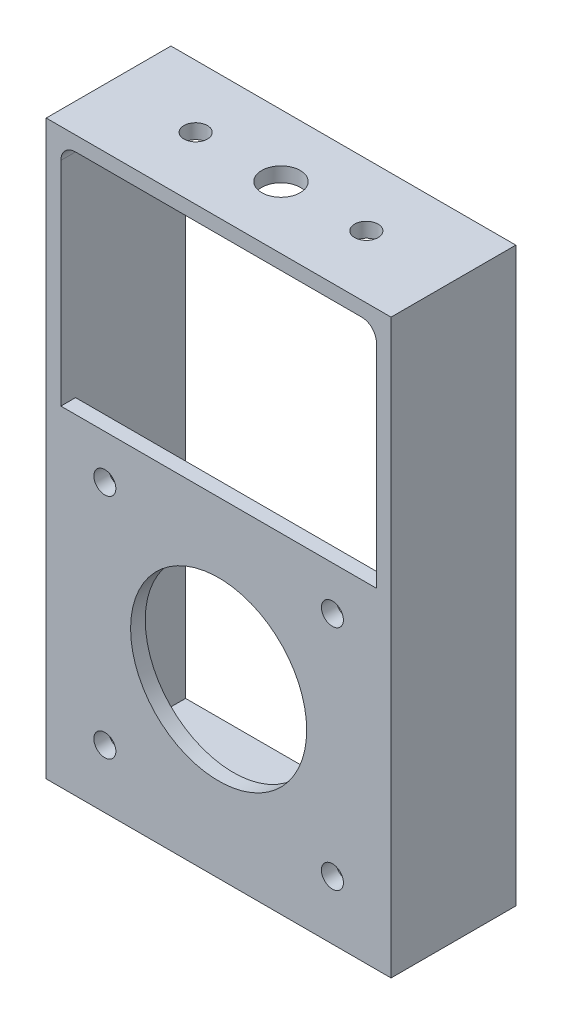
ISO-10303-21;
HEADER;
FILE_DESCRIPTION(('STEP AP214'),'2;1');
FILE_NAME('part.step','',(''),(''),'','','');
FILE_SCHEMA(('AUTOMOTIVE_DESIGN { 1 0 10303 214 1 1 1 1 }'));
ENDSEC;
DATA;
#1=APPLICATION_CONTEXT('core data for automotive mechanical design processes');
#2=APPLICATION_PROTOCOL_DEFINITION('international standard','automotive_design',2000,#1);
#3=PRODUCT_CONTEXT('',#1,'mechanical');
#4=PRODUCT('Part','Part','',(#3));
#5=PRODUCT_RELATED_PRODUCT_CATEGORY('part','',(#4));
#6=PRODUCT_DEFINITION_FORMATION('','',#4);
#7=PRODUCT_DEFINITION_CONTEXT('part definition',#1,'design');
#8=PRODUCT_DEFINITION('design','',#6,#7);
#9=PRODUCT_DEFINITION_SHAPE('','',#8);
#10=(LENGTH_UNIT() NAMED_UNIT(*) SI_UNIT(.MILLI.,.METRE.));
#11=(NAMED_UNIT(*) PLANE_ANGLE_UNIT() SI_UNIT($,.RADIAN.));
#12=(NAMED_UNIT(*) SI_UNIT($,.STERADIAN.) SOLID_ANGLE_UNIT());
#13=UNCERTAINTY_MEASURE_WITH_UNIT(LENGTH_MEASURE(1.E-05),#10,'distance_accuracy_value','');
#14=(GEOMETRIC_REPRESENTATION_CONTEXT(3) GLOBAL_UNCERTAINTY_ASSIGNED_CONTEXT((#13)) GLOBAL_UNIT_ASSIGNED_CONTEXT((#10,
#11,#12)) REPRESENTATION_CONTEXT('',''));
#15=CARTESIAN_POINT('',(0.,0.,0.));
#16=DIRECTION('',(0.,0.,1.));
#17=DIRECTION('',(1.,0.,0.));
#18=AXIS2_PLACEMENT_3D('',#15,#16,#17);
#19=CARTESIAN_POINT('',(0.,0.,15.));
#20=DIRECTION('',(0.,0.,1.));
#21=DIRECTION('',(1.,0.,0.));
#22=AXIS2_PLACEMENT_3D('',#19,#20,#21);
#23=PLANE('',#22);
#24=CARTESIAN_POINT('',(70.5833890467066,-3.39567391083385,15.));
#25=DIRECTION('',(0.,0.,-1.));
#26=DIRECTION('',(0.,1.,0.));
#27=AXIS2_PLACEMENT_3D('',#24,#25,#26);
#28=CIRCLE('',#27,1.5);
#29=CARTESIAN_POINT('',(70.5833890467066,-1.89567391083384,15.));
#30=VERTEX_POINT('',#29);
#31=EDGE_CURVE('E235',#30,#30,#28,.T.);
#32=ORIENTED_EDGE('',*,*,#31,.F.);
#33=EDGE_LOOP('',(#32));
#34=FACE_BOUND('',#33,.T.);
#35=CARTESIAN_POINT('',(70.5833890467065,-34.4093773336758,15.));
#36=DIRECTION('',(0.,0.,-1.));
#37=DIRECTION('',(1.,0.,0.));
#38=AXIS2_PLACEMENT_3D('',#35,#36,#37);
#39=CIRCLE('',#38,1.5);
#40=CARTESIAN_POINT('',(72.0833890467065,-34.4093773336758,15.));
#41=VERTEX_POINT('',#40);
#42=EDGE_CURVE('E338',#41,#41,#39,.T.);
#43=ORIENTED_EDGE('',*,*,#42,.F.);
#44=EDGE_LOOP('',(#43));
#45=FACE_BOUND('',#44,.T.);
#46=CARTESIAN_POINT('',(39.5696856238644,-34.4093773336756,15.));
#47=DIRECTION('',(0.,0.,-1.));
#48=DIRECTION('',(0.,-1.,0.));
#49=AXIS2_PLACEMENT_3D('',#46,#47,#48);
#50=CIRCLE('',#49,1.5);
#51=CARTESIAN_POINT('',(39.5696856238644,-35.9093773336756,15.));
#52=VERTEX_POINT('',#51);
#53=EDGE_CURVE('E251',#52,#52,#50,.T.);
#54=ORIENTED_EDGE('',*,*,#53,.F.);
#55=EDGE_LOOP('',(#54));
#56=FACE_BOUND('',#55,.T.);
#57=CARTESIAN_POINT('',(39.5696856238645,-3.39567391083379,15.));
#58=DIRECTION('',(0.,0.,-1.));
#59=DIRECTION('',(-1.,0.,0.));
#60=AXIS2_PLACEMENT_3D('',#57,#58,#59);
#61=CIRCLE('',#60,1.5);
#62=CARTESIAN_POINT('',(38.0696856238645,-3.39567391083379,15.));
#63=VERTEX_POINT('',#62);
#64=EDGE_CURVE('E230',#63,#63,#61,.T.);
#65=ORIENTED_EDGE('',*,*,#64,.F.);
#66=EDGE_LOOP('',(#65));
#67=FACE_BOUND('',#66,.T.);
#68=CARTESIAN_POINT('',(55.0765373352855,-18.9025256222548,15.));
#69=DIRECTION('',(0.,0.,-1.));
#70=DIRECTION('',(-1.,0.,0.));
#71=AXIS2_PLACEMENT_3D('',#68,#69,#70);
#72=CIRCLE('',#71,12.);
#73=CARTESIAN_POINT('',(43.0765373352855,-18.9025256222548,15.));
#74=VERTEX_POINT('',#73);
#75=EDGE_CURVE('E226',#74,#74,#72,.T.);
#76=ORIENTED_EDGE('',*,*,#75,.F.);
#77=EDGE_LOOP('',(#76));
#78=FACE_BOUND('',#77,.T.);
#79=DIRECTION('',(-1.,0.,0.));
#80=VECTOR('',#79,1.);
#81=CARTESIAN_POINT('',(76.5765373352855,2.59747437774523,15.));
#82=LINE('',#81,#80);
#83=CARTESIAN_POINT('',(76.5765373352855,2.59747437774523,15.));
#84=VERTEX_POINT('',#83);
#85=CARTESIAN_POINT('',(33.5765373352855,2.59747437774523,15.));
#86=VERTEX_POINT('',#85);
#87=EDGE_CURVE('E161',#84,#86,#82,.T.);
#88=ORIENTED_EDGE('',*,*,#87,.F.);
#89=DIRECTION('',(0.,1.,0.));
#90=VECTOR('',#89,1.);
#91=CARTESIAN_POINT('',(76.5765373352855,33.5974743777452,15.));
#92=LINE('',#91,#90);
#93=CARTESIAN_POINT('',(76.5765373352855,-40.4025256222548,15.));
#94=VERTEX_POINT('',#93);
#95=EDGE_CURVE('E173',#94,#84,#92,.T.);
#96=ORIENTED_EDGE('',*,*,#95,.F.);
#97=DIRECTION('',(1.,0.,0.));
#98=VECTOR('',#97,1.);
#99=CARTESIAN_POINT('',(33.5765373352855,-40.4025256222548,15.));
#100=LINE('',#99,#98);
#101=CARTESIAN_POINT('',(33.5765373352855,-40.4025256222548,15.));
#102=VERTEX_POINT('',#101);
#103=EDGE_CURVE('E169',#102,#94,#100,.T.);
#104=ORIENTED_EDGE('',*,*,#103,.F.);
#105=DIRECTION('',(0.,-1.,0.));
#106=VECTOR('',#105,1.);
#107=CARTESIAN_POINT('',(33.5765373352855,33.5974743777452,15.));
#108=LINE('',#107,#106);
#109=EDGE_CURVE('E151',#86,#102,#108,.T.);
#110=ORIENTED_EDGE('',*,*,#109,.F.);
#111=EDGE_LOOP('',(#88,#96,#104,#110));
#112=FACE_BOUND('',#111,.T.);
#113=ADVANCED_FACE('F57',(#34,#45,#56,#67,#78,#112),#23,.F.);
#114=CARTESIAN_POINT('',(0.,0.,0.));
#115=DIRECTION('',(0.,0.,1.));
#116=DIRECTION('',(1.,0.,0.));
#117=AXIS2_PLACEMENT_3D('',#114,#115,#116);
#118=PLANE('',#117);
#119=DIRECTION('',(0.,-1.,0.));
#120=VECTOR('',#119,1.);
#121=CARTESIAN_POINT('',(31.5765373352855,33.5974743777452,0.));
#122=LINE('',#121,#120);
#123=CARTESIAN_POINT('',(31.5765373352855,35.5974743777452,0.));
#124=VERTEX_POINT('',#123);
#125=CARTESIAN_POINT('',(31.5765373352855,-42.4025256222548,0.));
#126=VERTEX_POINT('',#125);
#127=EDGE_CURVE('E194',#124,#126,#122,.T.);
#128=ORIENTED_EDGE('',*,*,#127,.F.);
#129=DIRECTION('',(-1.,0.,0.));
#130=VECTOR('',#129,1.);
#131=CARTESIAN_POINT('',(33.5765373352855,35.5974743777452,0.));
#132=LINE('',#131,#130);
#133=CARTESIAN_POINT('',(78.5765373352855,35.5974743777452,0.));
#134=VERTEX_POINT('',#133);
#135=EDGE_CURVE('E201',#134,#124,#132,.T.);
#136=ORIENTED_EDGE('',*,*,#135,.F.);
#137=DIRECTION('',(0.,1.,0.));
#138=VECTOR('',#137,1.);
#139=CARTESIAN_POINT('',(78.5765373352855,33.5974743777452,0.));
#140=LINE('',#139,#138);
#141=CARTESIAN_POINT('',(78.5765373352855,-42.4025256222548,0.));
#142=VERTEX_POINT('',#141);
#143=EDGE_CURVE('E199',#142,#134,#140,.T.);
#144=ORIENTED_EDGE('',*,*,#143,.F.);
#145=DIRECTION('',(1.,0.,0.));
#146=VECTOR('',#145,1.);
#147=CARTESIAN_POINT('',(33.5765373352855,-42.4025256222548,0.));
#148=LINE('',#147,#146);
#149=EDGE_CURVE('E197',#126,#142,#148,.T.);
#150=ORIENTED_EDGE('',*,*,#149,.F.);
#151=EDGE_LOOP('',(#128,#136,#144,#150));
#152=FACE_BOUND('',#151,.T.);
#153=DIRECTION('',(-1.,0.,0.));
#154=VECTOR('',#153,1.);
#155=CARTESIAN_POINT('',(33.5765373352855,33.5974743777452,0.));
#156=LINE('',#155,#154);
#157=CARTESIAN_POINT('',(74.5765373352855,33.5974743777452,0.));
#158=VERTEX_POINT('',#157);
#159=CARTESIAN_POINT('',(35.5765373352855,33.5974743777452,0.));
#160=VERTEX_POINT('',#159);
#161=EDGE_CURVE('E171',#158,#160,#156,.T.);
#162=ORIENTED_EDGE('',*,*,#161,.T.);
#163=CARTESIAN_POINT('',(35.5765373352855,31.5974743777452,0.));
#164=DIRECTION('',(0.,0.,1.));
#165=DIRECTION('',(1.,0.,0.));
#166=AXIS2_PLACEMENT_3D('',#163,#164,#165);
#167=CIRCLE('',#166,2.);
#168=CARTESIAN_POINT('',(33.5765373352855,31.5974743777452,0.));
#169=VERTEX_POINT('',#168);
#170=EDGE_CURVE('E260',#160,#169,#167,.T.);
#171=ORIENTED_EDGE('',*,*,#170,.T.);
#172=DIRECTION('',(0.,-1.,0.));
#173=VECTOR('',#172,1.);
#174=CARTESIAN_POINT('',(33.5765373352855,33.5974743777452,0.));
#175=LINE('',#174,#173);
#176=CARTESIAN_POINT('',(33.5765373352855,-40.4025256222548,0.));
#177=VERTEX_POINT('',#176);
#178=EDGE_CURVE('E184',#169,#177,#175,.T.);
#179=ORIENTED_EDGE('',*,*,#178,.T.);
#180=DIRECTION('',(1.,0.,0.));
#181=VECTOR('',#180,1.);
#182=CARTESIAN_POINT('',(33.5765373352855,-40.4025256222548,0.));
#183=LINE('',#182,#181);
#184=CARTESIAN_POINT('',(76.5765373352855,-40.4025256222548,0.));
#185=VERTEX_POINT('',#184);
#186=EDGE_CURVE('E186',#177,#185,#183,.T.);
#187=ORIENTED_EDGE('',*,*,#186,.T.);
#188=DIRECTION('',(0.,1.,0.));
#189=VECTOR('',#188,1.);
#190=CARTESIAN_POINT('',(76.5765373352855,33.5974743777452,0.));
#191=LINE('',#190,#189);
#192=CARTESIAN_POINT('',(76.5765373352855,31.5974743777452,0.));
#193=VERTEX_POINT('',#192);
#194=EDGE_CURVE('E176',#185,#193,#191,.T.);
#195=ORIENTED_EDGE('',*,*,#194,.T.);
#196=CARTESIAN_POINT('',(74.5765373352855,31.5974743777452,0.));
#197=DIRECTION('',(0.,0.,1.));
#198=DIRECTION('',(1.,0.,0.));
#199=AXIS2_PLACEMENT_3D('',#196,#197,#198);
#200=CIRCLE('',#199,2.);
#201=EDGE_CURVE('E65',#193,#158,#200,.T.);
#202=ORIENTED_EDGE('',*,*,#201,.T.);
#203=EDGE_LOOP('',(#162,#171,#179,#187,#195,#202));
#204=FACE_BOUND('',#203,.T.);
#205=ADVANCED_FACE('F265',(#152,#204),#118,.F.);
#206=CARTESIAN_POINT('',(31.5765373352855,33.5974743777452,15.));
#207=DIRECTION('',(1.,0.,0.));
#208=DIRECTION('',(0.,1.,0.));
#209=AXIS2_PLACEMENT_3D('',#206,#207,#208);
#210=PLANE('',#209);
#211=ORIENTED_EDGE('',*,*,#127,.T.);
#212=DIRECTION('',(0.,0.,-1.));
#213=VECTOR('',#212,1.);
#214=CARTESIAN_POINT('',(31.5765373352855,-42.4025256222548,15.));
#215=LINE('',#214,#213);
#216=CARTESIAN_POINT('',(31.5765373352855,-42.4025256222548,17.));
#217=VERTEX_POINT('',#216);
#218=EDGE_CURVE('E212',#217,#126,#215,.T.);
#219=ORIENTED_EDGE('',*,*,#218,.F.);
#220=DIRECTION('',(0.,-1.,0.));
#221=VECTOR('',#220,1.);
#222=CARTESIAN_POINT('',(31.5765373352855,35.5974743777452,17.));
#223=LINE('',#222,#221);
#224=CARTESIAN_POINT('',(31.5765373352855,35.5974743777452,17.));
#225=VERTEX_POINT('',#224);
#226=EDGE_CURVE('E157',#225,#217,#223,.T.);
#227=ORIENTED_EDGE('',*,*,#226,.F.);
#228=DIRECTION('',(0.,0.,-1.));
#229=VECTOR('',#228,1.);
#230=CARTESIAN_POINT('',(31.5765373352855,35.5974743777452,15.));
#231=LINE('',#230,#229);
#232=EDGE_CURVE('E203',#225,#124,#231,.T.);
#233=ORIENTED_EDGE('',*,*,#232,.T.);
#234=EDGE_LOOP('',(#211,#219,#227,#233));
#235=FACE_BOUND('',#234,.T.);
#236=ADVANCED_FACE('F300',(#235),#210,.F.);
#237=CARTESIAN_POINT('',(33.5765373352855,-42.4025256222548,15.));
#238=DIRECTION('',(0.,1.,0.));
#239=DIRECTION('',(0.,0.,1.));
#240=AXIS2_PLACEMENT_3D('',#237,#238,#239);
#241=PLANE('',#240);
#242=ORIENTED_EDGE('',*,*,#149,.T.);
#243=DIRECTION('',(0.,0.,-1.));
#244=VECTOR('',#243,1.);
#245=CARTESIAN_POINT('',(78.5765373352855,-42.4025256222548,15.));
#246=LINE('',#245,#244);
#247=CARTESIAN_POINT('',(78.5765373352855,-42.4025256222548,17.));
#248=VERTEX_POINT('',#247);
#249=EDGE_CURVE('E209',#248,#142,#246,.T.);
#250=ORIENTED_EDGE('',*,*,#249,.F.);
#251=DIRECTION('',(1.,0.,0.));
#252=VECTOR('',#251,1.);
#253=CARTESIAN_POINT('',(31.5765373352855,-42.4025256222548,17.));
#254=LINE('',#253,#252);
#255=EDGE_CURVE('E350',#217,#248,#254,.T.);
#256=ORIENTED_EDGE('',*,*,#255,.F.);
#257=ORIENTED_EDGE('',*,*,#218,.T.);
#258=EDGE_LOOP('',(#242,#250,#256,#257));
#259=FACE_BOUND('',#258,.T.);
#260=ADVANCED_FACE('F363',(#259),#241,.F.);
#261=CARTESIAN_POINT('',(78.5765373352855,33.5974743777452,15.));
#262=DIRECTION('',(-1.,0.,0.));
#263=DIRECTION('',(0.,0.,1.));
#264=AXIS2_PLACEMENT_3D('',#261,#262,#263);
#265=PLANE('',#264);
#266=ORIENTED_EDGE('',*,*,#143,.T.);
#267=DIRECTION('',(0.,0.,-1.));
#268=VECTOR('',#267,1.);
#269=CARTESIAN_POINT('',(78.5765373352855,35.5974743777452,15.));
#270=LINE('',#269,#268);
#271=CARTESIAN_POINT('',(78.5765373352855,35.5974743777452,17.));
#272=VERTEX_POINT('',#271);
#273=EDGE_CURVE('E206',#272,#134,#270,.T.);
#274=ORIENTED_EDGE('',*,*,#273,.F.);
#275=DIRECTION('',(0.,1.,0.));
#276=VECTOR('',#275,1.);
#277=CARTESIAN_POINT('',(78.5765373352855,35.5974743777452,17.));
#278=LINE('',#277,#276);
#279=EDGE_CURVE('E352',#248,#272,#278,.T.);
#280=ORIENTED_EDGE('',*,*,#279,.F.);
#281=ORIENTED_EDGE('',*,*,#249,.T.);
#282=EDGE_LOOP('',(#266,#274,#280,#281));
#283=FACE_BOUND('',#282,.T.);
#284=ADVANCED_FACE('F365',(#283),#265,.F.);
#285=CARTESIAN_POINT('',(33.5765373352855,35.5974743777452,15.));
#286=DIRECTION('',(0.,-1.,0.));
#287=DIRECTION('',(0.,0.,-1.));
#288=AXIS2_PLACEMENT_3D('',#285,#286,#287);
#289=PLANE('',#288);
#290=CARTESIAN_POINT('',(66.7065373352855,35.5974743777452,8.5));
#291=DIRECTION('',(0.,1.,0.));
#292=DIRECTION('',(0.,0.,1.));
#293=AXIS2_PLACEMENT_3D('',#290,#291,#292);
#294=CIRCLE('',#293,1.6);
#295=CARTESIAN_POINT('',(66.7065373352855,35.5974743777452,10.1));
#296=VERTEX_POINT('',#295);
#297=EDGE_CURVE('E332',#296,#296,#294,.T.);
#298=ORIENTED_EDGE('',*,*,#297,.F.);
#299=EDGE_LOOP('',(#298));
#300=FACE_BOUND('',#299,.T.);
#301=CARTESIAN_POINT('',(43.4465373352855,35.5974743777452,8.5));
#302=DIRECTION('',(0.,1.,0.));
#303=DIRECTION('',(0.,0.,1.));
#304=AXIS2_PLACEMENT_3D('',#301,#302,#303);
#305=CIRCLE('',#304,1.6);
#306=CARTESIAN_POINT('',(43.4465373352855,35.5974743777452,10.1));
#307=VERTEX_POINT('',#306);
#308=EDGE_CURVE('E329',#307,#307,#305,.T.);
#309=ORIENTED_EDGE('',*,*,#308,.F.);
#310=EDGE_LOOP('',(#309));
#311=FACE_BOUND('',#310,.T.);
#312=CARTESIAN_POINT('',(55.0765373352855,35.5974743777452,8.5));
#313=DIRECTION('',(0.,1.,0.));
#314=DIRECTION('',(0.,0.,1.));
#315=AXIS2_PLACEMENT_3D('',#312,#313,#314);
#316=CIRCLE('',#315,2.625);
#317=CARTESIAN_POINT('',(55.0765373352855,35.5974743777452,11.125));
#318=VERTEX_POINT('',#317);
#319=EDGE_CURVE('E245',#318,#318,#316,.T.);
#320=ORIENTED_EDGE('',*,*,#319,.F.);
#321=EDGE_LOOP('',(#320));
#322=FACE_BOUND('',#321,.T.);
#323=ORIENTED_EDGE('',*,*,#135,.T.);
#324=ORIENTED_EDGE('',*,*,#232,.F.);
#325=DIRECTION('',(-1.,0.,0.));
#326=VECTOR('',#325,1.);
#327=CARTESIAN_POINT('',(31.5765373352855,35.5974743777452,17.));
#328=LINE('',#327,#326);
#329=EDGE_CURVE('E179',#272,#225,#328,.T.);
#330=ORIENTED_EDGE('',*,*,#329,.F.);
#331=ORIENTED_EDGE('',*,*,#273,.T.);
#332=EDGE_LOOP('',(#323,#324,#330,#331));
#333=FACE_BOUND('',#332,.T.);
#334=ADVANCED_FACE('F291',(#300,#311,#322,#333),#289,.F.);
#335=CARTESIAN_POINT('',(33.5765373352855,33.5974743777452,15.));
#336=DIRECTION('',(1.,0.,0.));
#337=DIRECTION('',(0.,1.,0.));
#338=AXIS2_PLACEMENT_3D('',#335,#336,#337);
#339=PLANE('',#338);
#340=ORIENTED_EDGE('',*,*,#178,.F.);
#341=DIRECTION('',(0.,0.,-1.));
#342=VECTOR('',#341,1.);
#343=CARTESIAN_POINT('',(33.5765373352855,31.5974743777452,17.));
#344=LINE('',#343,#342);
#345=CARTESIAN_POINT('',(33.5765373352855,31.5974743777452,17.));
#346=VERTEX_POINT('',#345);
#347=EDGE_CURVE('E256',#169,#346,#344,.F.);
#348=ORIENTED_EDGE('',*,*,#347,.T.);
#349=DIRECTION('',(0.,-1.,0.));
#350=VECTOR('',#349,1.);
#351=CARTESIAN_POINT('',(33.5765373352855,0.,17.));
#352=LINE('',#351,#350);
#353=CARTESIAN_POINT('',(33.5765373352855,2.59747437774523,17.));
#354=VERTEX_POINT('',#353);
#355=EDGE_CURVE('E154',#346,#354,#352,.T.);
#356=ORIENTED_EDGE('',*,*,#355,.T.);
#357=DIRECTION('',(0.,0.,-1.));
#358=VECTOR('',#357,1.);
#359=CARTESIAN_POINT('',(33.5765373352855,2.59747437774523,25.));
#360=LINE('',#359,#358);
#361=EDGE_CURVE('E145',#354,#86,#360,.T.);
#362=ORIENTED_EDGE('',*,*,#361,.T.);
#363=ORIENTED_EDGE('',*,*,#109,.T.);
#364=DIRECTION('',(0.,0.,-1.));
#365=VECTOR('',#364,1.);
#366=CARTESIAN_POINT('',(33.5765373352855,-40.4025256222548,15.));
#367=LINE('',#366,#365);
#368=EDGE_CURVE('E192',#102,#177,#367,.T.);
#369=ORIENTED_EDGE('',*,*,#368,.T.);
#370=EDGE_LOOP('',(#340,#348,#356,#362,#363,#369));
#371=FACE_BOUND('',#370,.T.);
#372=ADVANCED_FACE('F148',(#371),#339,.T.);
#373=CARTESIAN_POINT('',(33.5765373352855,-40.4025256222548,15.));
#374=DIRECTION('',(0.,1.,0.));
#375=DIRECTION('',(0.,0.,1.));
#376=AXIS2_PLACEMENT_3D('',#373,#374,#375);
#377=PLANE('',#376);
#378=ORIENTED_EDGE('',*,*,#186,.F.);
#379=ORIENTED_EDGE('',*,*,#368,.F.);
#380=ORIENTED_EDGE('',*,*,#103,.T.);
#381=DIRECTION('',(0.,0.,-1.));
#382=VECTOR('',#381,1.);
#383=CARTESIAN_POINT('',(76.5765373352855,-40.4025256222548,15.));
#384=LINE('',#383,#382);
#385=EDGE_CURVE('E183',#94,#185,#384,.T.);
#386=ORIENTED_EDGE('',*,*,#385,.T.);
#387=EDGE_LOOP('',(#378,#379,#380,#386));
#388=FACE_BOUND('',#387,.T.);
#389=ADVANCED_FACE('F281',(#388),#377,.T.);
#390=CARTESIAN_POINT('',(76.5765373352855,33.5974743777452,15.));
#391=DIRECTION('',(-1.,0.,0.));
#392=DIRECTION('',(0.,0.,1.));
#393=AXIS2_PLACEMENT_3D('',#390,#391,#392);
#394=PLANE('',#393);
#395=DIRECTION('',(0.,1.,0.));
#396=VECTOR('',#395,1.);
#397=CARTESIAN_POINT('',(76.5765373352855,0.,17.));
#398=LINE('',#397,#396);
#399=CARTESIAN_POINT('',(76.5765373352855,2.59747437774523,17.));
#400=VERTEX_POINT('',#399);
#401=CARTESIAN_POINT('',(76.5765373352855,31.5974743777452,17.));
#402=VERTEX_POINT('',#401);
#403=EDGE_CURVE('E221',#400,#402,#398,.T.);
#404=ORIENTED_EDGE('',*,*,#403,.T.);
#405=DIRECTION('',(0.,0.,-1.));
#406=VECTOR('',#405,1.);
#407=CARTESIAN_POINT('',(76.5765373352855,31.5974743777452,0.));
#408=LINE('',#407,#406);
#409=EDGE_CURVE('E258',#402,#193,#408,.T.);
#410=ORIENTED_EDGE('',*,*,#409,.T.);
#411=ORIENTED_EDGE('',*,*,#194,.F.);
#412=ORIENTED_EDGE('',*,*,#385,.F.);
#413=ORIENTED_EDGE('',*,*,#95,.T.);
#414=DIRECTION('',(0.,0.,-1.));
#415=VECTOR('',#414,1.);
#416=CARTESIAN_POINT('',(76.5765373352855,2.59747437774523,25.));
#417=LINE('',#416,#415);
#418=EDGE_CURVE('E158',#400,#84,#417,.T.);
#419=ORIENTED_EDGE('',*,*,#418,.F.);
#420=EDGE_LOOP('',(#404,#410,#411,#412,#413,#419));
#421=FACE_BOUND('',#420,.T.);
#422=ADVANCED_FACE('F271',(#421),#394,.T.);
#423=CARTESIAN_POINT('',(33.5765373352855,33.5974743777452,15.));
#424=DIRECTION('',(0.,-1.,0.));
#425=DIRECTION('',(0.,0.,-1.));
#426=AXIS2_PLACEMENT_3D('',#423,#424,#425);
#427=PLANE('',#426);
#428=CARTESIAN_POINT('',(66.7065373352855,33.5974743777452,8.5));
#429=DIRECTION('',(0.,-1.,0.));
#430=DIRECTION('',(0.,0.,-1.));
#431=AXIS2_PLACEMENT_3D('',#428,#429,#430);
#432=CIRCLE('',#431,1.6);
#433=CARTESIAN_POINT('',(66.7065373352855,33.5974743777452,6.9));
#434=VERTEX_POINT('',#433);
#435=EDGE_CURVE('E248',#434,#434,#432,.T.);
#436=ORIENTED_EDGE('',*,*,#435,.F.);
#437=EDGE_LOOP('',(#436));
#438=FACE_BOUND('',#437,.T.);
#439=CARTESIAN_POINT('',(43.4465373352855,33.5974743777452,8.5));
#440=DIRECTION('',(0.,-1.,0.));
#441=DIRECTION('',(0.,0.,-1.));
#442=AXIS2_PLACEMENT_3D('',#439,#440,#441);
#443=CIRCLE('',#442,1.6);
#444=CARTESIAN_POINT('',(43.4465373352855,33.5974743777452,6.9));
#445=VERTEX_POINT('',#444);
#446=EDGE_CURVE('E244',#445,#445,#443,.T.);
#447=ORIENTED_EDGE('',*,*,#446,.F.);
#448=EDGE_LOOP('',(#447));
#449=FACE_BOUND('',#448,.T.);
#450=CARTESIAN_POINT('',(55.0765373352855,33.5974743777452,8.5));
#451=DIRECTION('',(0.,-1.,0.));
#452=DIRECTION('',(0.,0.,-1.));
#453=AXIS2_PLACEMENT_3D('',#450,#451,#452);
#454=CIRCLE('',#453,2.625);
#455=CARTESIAN_POINT('',(55.0765373352855,33.5974743777452,5.875));
#456=VERTEX_POINT('',#455);
#457=EDGE_CURVE('E241',#456,#456,#454,.T.);
#458=ORIENTED_EDGE('',*,*,#457,.F.);
#459=EDGE_LOOP('',(#458));
#460=FACE_BOUND('',#459,.T.);
#461=DIRECTION('',(-1.,0.,0.));
#462=VECTOR('',#461,1.);
#463=CARTESIAN_POINT('',(0.,33.5974743777452,17.));
#464=LINE('',#463,#462);
#465=CARTESIAN_POINT('',(74.5765373352855,33.5974743777452,17.));
#466=VERTEX_POINT('',#465);
#467=CARTESIAN_POINT('',(35.5765373352855,33.5974743777452,17.));
#468=VERTEX_POINT('',#467);
#469=EDGE_CURVE('E218',#466,#468,#464,.T.);
#470=ORIENTED_EDGE('',*,*,#469,.T.);
#471=DIRECTION('',(0.,0.,-1.));
#472=VECTOR('',#471,1.);
#473=CARTESIAN_POINT('',(35.5765373352855,33.5974743777452,0.));
#474=LINE('',#473,#472);
#475=EDGE_CURVE('E253',#468,#160,#474,.T.);
#476=ORIENTED_EDGE('',*,*,#475,.T.);
#477=ORIENTED_EDGE('',*,*,#161,.F.);
#478=DIRECTION('',(0.,0.,-1.));
#479=VECTOR('',#478,1.);
#480=CARTESIAN_POINT('',(74.5765373352855,33.5974743777452,17.));
#481=LINE('',#480,#479);
#482=EDGE_CURVE('E223',#158,#466,#481,.F.);
#483=ORIENTED_EDGE('',*,*,#482,.T.);
#484=EDGE_LOOP('',(#470,#476,#477,#483));
#485=FACE_BOUND('',#484,.T.);
#486=ADVANCED_FACE('F268',(#438,#449,#460,#485),#427,.T.);
#487=CARTESIAN_POINT('',(0.,0.,17.));
#488=DIRECTION('',(0.,0.,1.));
#489=DIRECTION('',(1.,0.,0.));
#490=AXIS2_PLACEMENT_3D('',#487,#488,#489);
#491=PLANE('',#490);
#492=CARTESIAN_POINT('',(70.5833890467066,-3.39567391083385,17.));
#493=DIRECTION('',(0.,0.,1.));
#494=DIRECTION('',(1.,0.,0.));
#495=AXIS2_PLACEMENT_3D('',#492,#493,#494);
#496=CIRCLE('',#495,1.5);
#497=CARTESIAN_POINT('',(72.0833890467066,-3.39567391083385,17.));
#498=VERTEX_POINT('',#497);
#499=EDGE_CURVE('E238',#498,#498,#496,.T.);
#500=ORIENTED_EDGE('',*,*,#499,.F.);
#501=EDGE_LOOP('',(#500));
#502=FACE_BOUND('',#501,.T.);
#503=CARTESIAN_POINT('',(70.5833890467065,-34.4093773336758,17.));
#504=DIRECTION('',(0.,0.,1.));
#505=DIRECTION('',(1.,0.,0.));
#506=AXIS2_PLACEMENT_3D('',#503,#504,#505);
#507=CIRCLE('',#506,1.5);
#508=CARTESIAN_POINT('',(72.0833890467065,-34.4093773336758,17.));
#509=VERTEX_POINT('',#508);
#510=EDGE_CURVE('E234',#509,#509,#507,.T.);
#511=ORIENTED_EDGE('',*,*,#510,.F.);
#512=EDGE_LOOP('',(#511));
#513=FACE_BOUND('',#512,.T.);
#514=CARTESIAN_POINT('',(39.5696856238644,-34.4093773336756,17.));
#515=DIRECTION('',(0.,0.,1.));
#516=DIRECTION('',(1.,0.,0.));
#517=AXIS2_PLACEMENT_3D('',#514,#515,#516);
#518=CIRCLE('',#517,1.5);
#519=CARTESIAN_POINT('',(41.0696856238644,-34.4093773336756,17.));
#520=VERTEX_POINT('',#519);
#521=EDGE_CURVE('E231',#520,#520,#518,.T.);
#522=ORIENTED_EDGE('',*,*,#521,.F.);
#523=EDGE_LOOP('',(#522));
#524=FACE_BOUND('',#523,.T.);
#525=CARTESIAN_POINT('',(39.5696856238645,-3.39567391083379,17.));
#526=DIRECTION('',(0.,0.,1.));
#527=DIRECTION('',(1.,0.,0.));
#528=AXIS2_PLACEMENT_3D('',#525,#526,#527);
#529=CIRCLE('',#528,1.5);
#530=CARTESIAN_POINT('',(41.0696856238645,-3.39567391083379,17.));
#531=VERTEX_POINT('',#530);
#532=EDGE_CURVE('E227',#531,#531,#529,.T.);
#533=ORIENTED_EDGE('',*,*,#532,.F.);
#534=EDGE_LOOP('',(#533));
#535=FACE_BOUND('',#534,.T.);
#536=CARTESIAN_POINT('',(55.0765373352855,-18.9025256222548,17.));
#537=DIRECTION('',(0.,0.,1.));
#538=DIRECTION('',(1.,0.,0.));
#539=AXIS2_PLACEMENT_3D('',#536,#537,#538);
#540=CIRCLE('',#539,12.);
#541=CARTESIAN_POINT('',(67.0765373352855,-18.9025256222548,17.));
#542=VERTEX_POINT('',#541);
#543=EDGE_CURVE('E166',#542,#542,#540,.T.);
#544=ORIENTED_EDGE('',*,*,#543,.F.);
#545=EDGE_LOOP('',(#544));
#546=FACE_BOUND('',#545,.T.);
#547=ORIENTED_EDGE('',*,*,#403,.F.);
#548=DIRECTION('',(1.,0.,0.));
#549=VECTOR('',#548,1.);
#550=CARTESIAN_POINT('',(0.,2.59747437774523,17.));
#551=LINE('',#550,#549);
#552=EDGE_CURVE('E215',#354,#400,#551,.T.);
#553=ORIENTED_EDGE('',*,*,#552,.F.);
#554=ORIENTED_EDGE('',*,*,#355,.F.);
#555=CARTESIAN_POINT('',(35.5765373352855,31.5974743777452,17.));
#556=DIRECTION('',(0.,0.,1.));
#557=DIRECTION('',(1.,0.,0.));
#558=AXIS2_PLACEMENT_3D('',#555,#556,#557);
#559=CIRCLE('',#558,2.);
#560=EDGE_CURVE('E262',#346,#468,#559,.F.);
#561=ORIENTED_EDGE('',*,*,#560,.T.);
#562=ORIENTED_EDGE('',*,*,#469,.F.);
#563=CARTESIAN_POINT('',(74.5765373352855,31.5974743777452,17.));
#564=DIRECTION('',(0.,0.,1.));
#565=DIRECTION('',(1.,0.,0.));
#566=AXIS2_PLACEMENT_3D('',#563,#564,#565);
#567=CIRCLE('',#566,2.);
#568=EDGE_CURVE('E12',#466,#402,#567,.F.);
#569=ORIENTED_EDGE('',*,*,#568,.T.);
#570=EDGE_LOOP('',(#547,#553,#554,#561,#562,#569));
#571=FACE_BOUND('',#570,.T.);
#572=ORIENTED_EDGE('',*,*,#226,.T.);
#573=ORIENTED_EDGE('',*,*,#255,.T.);
#574=ORIENTED_EDGE('',*,*,#279,.T.);
#575=ORIENTED_EDGE('',*,*,#329,.T.);
#576=EDGE_LOOP('',(#572,#573,#574,#575));
#577=FACE_BOUND('',#576,.T.);
#578=ADVANCED_FACE('F273',(#502,#513,#524,#535,#546,#571,#577),#491,.T.);
#579=CARTESIAN_POINT('',(76.5765373352855,2.59747437774523,25.));
#580=DIRECTION('',(0.,-1.,0.));
#581=DIRECTION('',(0.,0.,-1.));
#582=AXIS2_PLACEMENT_3D('',#579,#580,#581);
#583=PLANE('',#582);
#584=ORIENTED_EDGE('',*,*,#552,.T.);
#585=ORIENTED_EDGE('',*,*,#418,.T.);
#586=ORIENTED_EDGE('',*,*,#87,.T.);
#587=ORIENTED_EDGE('',*,*,#361,.F.);
#588=EDGE_LOOP('',(#584,#585,#586,#587));
#589=FACE_BOUND('',#588,.T.);
#590=ADVANCED_FACE('F162',(#589),#583,.F.);
#591=CARTESIAN_POINT('',(55.0765373352855,-18.9025256222548,25.));
#592=DIRECTION('',(0.,0.,-1.));
#593=DIRECTION('',(-1.,0.,0.));
#594=AXIS2_PLACEMENT_3D('',#591,#592,#593);
#595=CYLINDRICAL_SURFACE('',#594,12.);
#596=ORIENTED_EDGE('',*,*,#543,.T.);
#597=EDGE_LOOP('',(#596));
#598=FACE_BOUND('',#597,.T.);
#599=ORIENTED_EDGE('',*,*,#75,.T.);
#600=EDGE_LOOP('',(#599));
#601=FACE_BOUND('',#600,.T.);
#602=ADVANCED_FACE('F410',(#598,#601),#595,.F.);
#603=CARTESIAN_POINT('',(39.5696856238645,-3.39567391083379,25.));
#604=DIRECTION('',(0.,0.,-1.));
#605=DIRECTION('',(-1.,0.,0.));
#606=AXIS2_PLACEMENT_3D('',#603,#604,#605);
#607=CYLINDRICAL_SURFACE('',#606,1.5);
#608=ORIENTED_EDGE('',*,*,#532,.T.);
#609=EDGE_LOOP('',(#608));
#610=FACE_BOUND('',#609,.T.);
#611=ORIENTED_EDGE('',*,*,#64,.T.);
#612=EDGE_LOOP('',(#611));
#613=FACE_BOUND('',#612,.T.);
#614=ADVANCED_FACE('F406',(#610,#613),#607,.F.);
#615=CARTESIAN_POINT('',(39.5696856238644,-34.4093773336756,25.));
#616=DIRECTION('',(0.,0.,-1.));
#617=DIRECTION('',(-1.,0.,0.));
#618=AXIS2_PLACEMENT_3D('',#615,#616,#617);
#619=CYLINDRICAL_SURFACE('',#618,1.5);
#620=ORIENTED_EDGE('',*,*,#521,.T.);
#621=EDGE_LOOP('',(#620));
#622=FACE_BOUND('',#621,.T.);
#623=ORIENTED_EDGE('',*,*,#53,.T.);
#624=EDGE_LOOP('',(#623));
#625=FACE_BOUND('',#624,.T.);
#626=ADVANCED_FACE('F402',(#622,#625),#619,.F.);
#627=CARTESIAN_POINT('',(70.5833890467065,-34.4093773336758,25.));
#628=DIRECTION('',(0.,0.,-1.));
#629=DIRECTION('',(-1.,0.,0.));
#630=AXIS2_PLACEMENT_3D('',#627,#628,#629);
#631=CYLINDRICAL_SURFACE('',#630,1.5);
#632=ORIENTED_EDGE('',*,*,#510,.T.);
#633=EDGE_LOOP('',(#632));
#634=FACE_BOUND('',#633,.T.);
#635=ORIENTED_EDGE('',*,*,#42,.T.);
#636=EDGE_LOOP('',(#635));
#637=FACE_BOUND('',#636,.T.);
#638=ADVANCED_FACE('F398',(#634,#637),#631,.F.);
#639=CARTESIAN_POINT('',(70.5833890467066,-3.39567391083385,25.));
#640=DIRECTION('',(0.,0.,-1.));
#641=DIRECTION('',(-1.,0.,0.));
#642=AXIS2_PLACEMENT_3D('',#639,#640,#641);
#643=CYLINDRICAL_SURFACE('',#642,1.5);
#644=ORIENTED_EDGE('',*,*,#499,.T.);
#645=EDGE_LOOP('',(#644));
#646=FACE_BOUND('',#645,.T.);
#647=ORIENTED_EDGE('',*,*,#31,.T.);
#648=EDGE_LOOP('',(#647));
#649=FACE_BOUND('',#648,.T.);
#650=ADVANCED_FACE('F324',(#646,#649),#643,.F.);
#651=CARTESIAN_POINT('',(55.0765373352855,25.5974743777452,8.5));
#652=DIRECTION('',(0.,1.,0.));
#653=DIRECTION('',(0.,0.,1.));
#654=AXIS2_PLACEMENT_3D('',#651,#652,#653);
#655=CYLINDRICAL_SURFACE('',#654,2.625);
#656=ORIENTED_EDGE('',*,*,#457,.T.);
#657=EDGE_LOOP('',(#656));
#658=FACE_BOUND('',#657,.T.);
#659=ORIENTED_EDGE('',*,*,#319,.T.);
#660=EDGE_LOOP('',(#659));
#661=FACE_BOUND('',#660,.T.);
#662=ADVANCED_FACE('F320',(#658,#661),#655,.F.);
#663=CARTESIAN_POINT('',(43.4465373352855,25.5974743777452,8.5));
#664=DIRECTION('',(0.,1.,0.));
#665=DIRECTION('',(0.,0.,1.));
#666=AXIS2_PLACEMENT_3D('',#663,#664,#665);
#667=CYLINDRICAL_SURFACE('',#666,1.6);
#668=ORIENTED_EDGE('',*,*,#446,.T.);
#669=EDGE_LOOP('',(#668));
#670=FACE_BOUND('',#669,.T.);
#671=ORIENTED_EDGE('',*,*,#308,.T.);
#672=EDGE_LOOP('',(#671));
#673=FACE_BOUND('',#672,.T.);
#674=ADVANCED_FACE('F323',(#670,#673),#667,.F.);
#675=CARTESIAN_POINT('',(66.7065373352855,25.5974743777452,8.5));
#676=DIRECTION('',(0.,1.,0.));
#677=DIRECTION('',(0.,0.,1.));
#678=AXIS2_PLACEMENT_3D('',#675,#676,#677);
#679=CYLINDRICAL_SURFACE('',#678,1.6);
#680=ORIENTED_EDGE('',*,*,#435,.T.);
#681=EDGE_LOOP('',(#680));
#682=FACE_BOUND('',#681,.T.);
#683=ORIENTED_EDGE('',*,*,#297,.T.);
#684=EDGE_LOOP('',(#683));
#685=FACE_BOUND('',#684,.T.);
#686=ADVANCED_FACE('F382',(#682,#685),#679,.F.);
#687=CARTESIAN_POINT('',(35.5765373352855,31.5974743777452,15.));
#688=DIRECTION('',(0.,0.,1.));
#689=DIRECTION('',(1.,0.,0.));
#690=AXIS2_PLACEMENT_3D('',#687,#688,#689);
#691=CYLINDRICAL_SURFACE('',#690,2.);
#692=ORIENTED_EDGE('',*,*,#560,.F.);
#693=ORIENTED_EDGE('',*,*,#347,.F.);
#694=ORIENTED_EDGE('',*,*,#170,.F.);
#695=ORIENTED_EDGE('',*,*,#475,.F.);
#696=EDGE_LOOP('',(#692,#693,#694,#695));
#697=FACE_BOUND('',#696,.T.);
#698=ADVANCED_FACE('F278',(#697),#691,.F.);
#699=CARTESIAN_POINT('',(74.5765373352855,31.5974743777452,15.));
#700=DIRECTION('',(0.,0.,1.));
#701=DIRECTION('',(1.,0.,0.));
#702=AXIS2_PLACEMENT_3D('',#699,#700,#701);
#703=CYLINDRICAL_SURFACE('',#702,2.);
#704=ORIENTED_EDGE('',*,*,#568,.F.);
#705=ORIENTED_EDGE('',*,*,#482,.F.);
#706=ORIENTED_EDGE('',*,*,#201,.F.);
#707=ORIENTED_EDGE('',*,*,#409,.F.);
#708=EDGE_LOOP('',(#704,#705,#706,#707));
#709=FACE_BOUND('',#708,.T.);
#710=ADVANCED_FACE('F59',(#709),#703,.F.);
#711=CLOSED_SHELL('',(#113,#205,#236,#260,#284,#334,#372,#389,#422,#486,#578,#590,#602,#614,
#626,#638,#650,#662,#674,#686,#698,#710));
#712=MANIFOLD_SOLID_BREP('B2',#711);
#713=ADVANCED_BREP_SHAPE_REPRESENTATION('',(#18,#712),#14);
#714=SHAPE_DEFINITION_REPRESENTATION(#9,#713);
ENDSEC;
END-ISO-10303-21;
